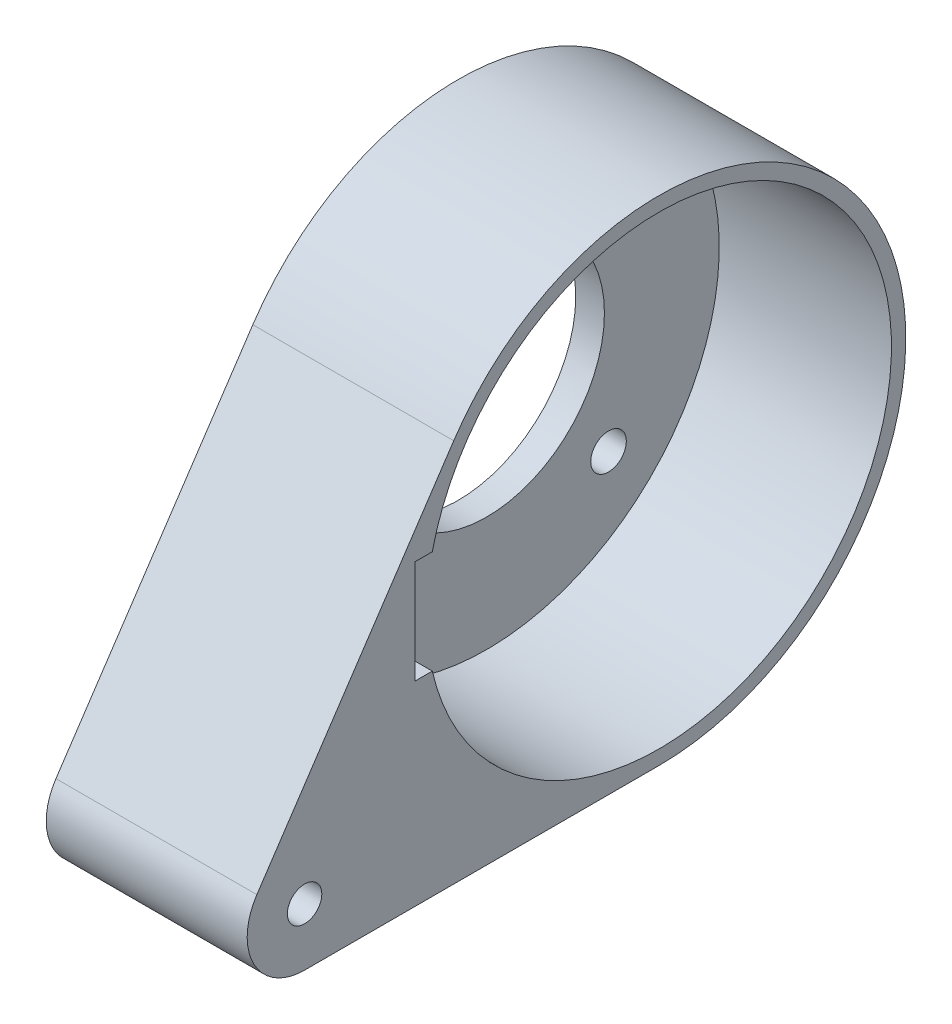
ISO-10303-21;
HEADER;
FILE_DESCRIPTION(('STEP AP214'),'2;1');
FILE_NAME('part.step','',(''),(''),'','','');
FILE_SCHEMA(('AUTOMOTIVE_DESIGN { 1 0 10303 214 1 1 1 1 }'));
ENDSEC;
DATA;
#1=APPLICATION_CONTEXT('core data for automotive mechanical design processes');
#2=APPLICATION_PROTOCOL_DEFINITION('international standard','automotive_design',2000,#1);
#3=PRODUCT_CONTEXT('',#1,'mechanical');
#4=PRODUCT('Part','Part','',(#3));
#5=PRODUCT_RELATED_PRODUCT_CATEGORY('part','',(#4));
#6=PRODUCT_DEFINITION_FORMATION('','',#4);
#7=PRODUCT_DEFINITION_CONTEXT('part definition',#1,'design');
#8=PRODUCT_DEFINITION('design','',#6,#7);
#9=PRODUCT_DEFINITION_SHAPE('','',#8);
#10=(LENGTH_UNIT() NAMED_UNIT(*) SI_UNIT(.MILLI.,.METRE.));
#11=(NAMED_UNIT(*) PLANE_ANGLE_UNIT() SI_UNIT($,.RADIAN.));
#12=(NAMED_UNIT(*) SI_UNIT($,.STERADIAN.) SOLID_ANGLE_UNIT());
#13=UNCERTAINTY_MEASURE_WITH_UNIT(LENGTH_MEASURE(1.E-05),#10,'distance_accuracy_value','');
#14=(GEOMETRIC_REPRESENTATION_CONTEXT(3) GLOBAL_UNCERTAINTY_ASSIGNED_CONTEXT((#13)) GLOBAL_UNIT_ASSIGNED_CONTEXT((#10,
#11,#12)) REPRESENTATION_CONTEXT('',''));
#15=CARTESIAN_POINT('',(0.,0.,0.));
#16=DIRECTION('',(0.,0.,1.));
#17=DIRECTION('',(1.,0.,0.));
#18=AXIS2_PLACEMENT_3D('',#15,#16,#17);
#19=CARTESIAN_POINT('',(2.5,-16.5,30.8666486681013));
#20=DIRECTION('',(1.,0.,0.));
#21=DIRECTION('',(0.,0.,-1.));
#22=AXIS2_PLACEMENT_3D('',#19,#20,#21);
#23=PLANE('',#22);
#24=CARTESIAN_POINT('',(2.5,0.,0.));
#25=DIRECTION('',(1.,0.,0.));
#26=DIRECTION('',(0.,0.,-1.));
#27=AXIS2_PLACEMENT_3D('',#24,#25,#26);
#28=CIRCLE('',#27,10.25);
#29=CARTESIAN_POINT('',(2.5,0.,-10.25));
#30=VERTEX_POINT('',#29);
#31=EDGE_CURVE('E183',#30,#30,#28,.T.);
#32=ORIENTED_EDGE('',*,*,#31,.F.);
#33=EDGE_LOOP('',(#32));
#34=FACE_BOUND('',#33,.T.);
#35=CARTESIAN_POINT('',(2.5,14.488887394336,-3.88228567653784));
#36=DIRECTION('',(1.,0.,0.));
#37=DIRECTION('',(0.,0.,1.));
#38=AXIS2_PLACEMENT_3D('',#35,#36,#37);
#39=CIRCLE('',#38,1.55);
#40=CARTESIAN_POINT('',(2.5,14.488887394336,-2.33228567653784));
#41=VERTEX_POINT('',#40);
#42=EDGE_CURVE('E177',#41,#41,#39,.T.);
#43=ORIENTED_EDGE('',*,*,#42,.F.);
#44=EDGE_LOOP('',(#43));
#45=FACE_BOUND('',#44,.T.);
#46=CARTESIAN_POINT('',(2.5,-10.6066017177982,-10.6066017177982));
#47=DIRECTION('',(1.,0.,0.));
#48=DIRECTION('',(0.,0.,1.));
#49=AXIS2_PLACEMENT_3D('',#46,#47,#48);
#50=CIRCLE('',#49,1.55);
#51=CARTESIAN_POINT('',(2.5,-10.6066017177982,-9.05660171779819));
#52=VERTEX_POINT('',#51);
#53=EDGE_CURVE('E171',#52,#52,#50,.T.);
#54=ORIENTED_EDGE('',*,*,#53,.F.);
#55=EDGE_LOOP('',(#54));
#56=FACE_BOUND('',#55,.T.);
#57=CARTESIAN_POINT('',(2.5,-3.88228567653778,14.488887394336));
#58=DIRECTION('',(1.,0.,0.));
#59=DIRECTION('',(0.,0.,1.));
#60=AXIS2_PLACEMENT_3D('',#57,#58,#59);
#61=CIRCLE('',#60,1.55);
#62=CARTESIAN_POINT('',(2.5,-3.88228567653778,16.038887394336));
#63=VERTEX_POINT('',#62);
#64=EDGE_CURVE('E165',#63,#63,#61,.T.);
#65=ORIENTED_EDGE('',*,*,#64,.F.);
#66=EDGE_LOOP('',(#65));
#67=FACE_BOUND('',#66,.T.);
#68=CARTESIAN_POINT('',(2.5,0.,0.));
#69=DIRECTION('',(-1.,0.,0.));
#70=DIRECTION('',(0.,0.,1.));
#71=AXIS2_PLACEMENT_3D('',#68,#69,#70);
#72=CIRCLE('',#71,20.25);
#73=CARTESIAN_POINT('',(2.5,0.,20.25));
#74=VERTEX_POINT('',#73);
#75=EDGE_CURVE('E146',#74,#74,#72,.T.);
#76=ORIENTED_EDGE('',*,*,#75,.F.);
#77=EDGE_LOOP('',(#76));
#78=FACE_BOUND('',#77,.T.);
#79=ADVANCED_FACE('F40',(#34,#45,#56,#67,#78),#23,.T.);
#80=CARTESIAN_POINT('',(2.5,-16.5,30.8666486681013));
#81=DIRECTION('',(-1.,0.,0.));
#82=DIRECTION('',(0.,0.,1.));
#83=AXIS2_PLACEMENT_3D('',#80,#81,#82);
#84=CYLINDRICAL_SURFACE('',#83,5.);
#85=CARTESIAN_POINT('',(0.,-16.5,30.8666486681013));
#86=DIRECTION('',(1.,0.,0.));
#87=DIRECTION('',(0.,0.,-1.));
#88=AXIS2_PLACEMENT_3D('',#85,#86,#87);
#89=CIRCLE('',#88,5.);
#90=CARTESIAN_POINT('',(0.,-13.7224489795918,35.0241972642129));
#91=VERTEX_POINT('',#90);
#92=CARTESIAN_POINT('',(0.,-21.5,30.8666486681013));
#93=VERTEX_POINT('',#92);
#94=EDGE_CURVE('E189',#91,#93,#89,.T.);
#95=ORIENTED_EDGE('',*,*,#94,.T.);
#96=DIRECTION('',(-1.,0.,0.));
#97=VECTOR('',#96,1.);
#98=CARTESIAN_POINT('',(2.5,-21.5,30.8666486681013));
#99=LINE('',#98,#97);
#100=CARTESIAN_POINT('',(17.5,-21.5,30.8666486681013));
#101=VERTEX_POINT('',#100);
#102=EDGE_CURVE('E48',#101,#93,#99,.T.);
#103=ORIENTED_EDGE('',*,*,#102,.F.);
#104=CARTESIAN_POINT('',(17.5,-16.5,30.8666486681013));
#105=DIRECTION('',(-1.,0.,0.));
#106=DIRECTION('',(0.,0.,1.));
#107=AXIS2_PLACEMENT_3D('',#104,#105,#106);
#108=CIRCLE('',#107,5.);
#109=CARTESIAN_POINT('',(17.5,-13.7224489795918,35.0241972642129));
#110=VERTEX_POINT('',#109);
#111=EDGE_CURVE('E159',#101,#110,#108,.T.);
#112=ORIENTED_EDGE('',*,*,#111,.T.);
#113=DIRECTION('',(-1.,0.,0.));
#114=VECTOR('',#113,1.);
#115=CARTESIAN_POINT('',(2.5,-13.7224489795918,35.0241972642129));
#116=LINE('',#115,#114);
#117=EDGE_CURVE('E197',#110,#91,#116,.T.);
#118=ORIENTED_EDGE('',*,*,#117,.T.);
#119=EDGE_LOOP('',(#95,#103,#112,#118));
#120=FACE_BOUND('',#119,.T.);
#121=ADVANCED_FACE('F42',(#120),#84,.T.);
#122=CARTESIAN_POINT('',(2.5,-21.5,30.8666486681013));
#123=DIRECTION('',(0.,1.,0.));
#124=DIRECTION('',(0.,0.,1.));
#125=AXIS2_PLACEMENT_3D('',#122,#123,#124);
#126=PLANE('',#125);
#127=DIRECTION('',(0.,0.,-1.));
#128=VECTOR('',#127,1.);
#129=CARTESIAN_POINT('',(0.,-21.5,30.8666486681013));
#130=LINE('',#129,#128);
#131=CARTESIAN_POINT('',(0.,-21.5,0.));
#132=VERTEX_POINT('',#131);
#133=EDGE_CURVE('E192',#93,#132,#130,.T.);
#134=ORIENTED_EDGE('',*,*,#133,.T.);
#135=DIRECTION('',(-1.,0.,0.));
#136=VECTOR('',#135,1.);
#137=CARTESIAN_POINT('',(2.5,-21.5,0.));
#138=LINE('',#137,#136);
#139=CARTESIAN_POINT('',(17.5,-21.5,0.));
#140=VERTEX_POINT('',#139);
#141=EDGE_CURVE('E201',#140,#132,#138,.T.);
#142=ORIENTED_EDGE('',*,*,#141,.F.);
#143=DIRECTION('',(0.,0.,1.));
#144=VECTOR('',#143,1.);
#145=CARTESIAN_POINT('',(17.5,-21.5,0.));
#146=LINE('',#145,#144);
#147=EDGE_CURVE('E156',#140,#101,#146,.T.);
#148=ORIENTED_EDGE('',*,*,#147,.T.);
#149=ORIENTED_EDGE('',*,*,#102,.T.);
#150=EDGE_LOOP('',(#134,#142,#148,#149));
#151=FACE_BOUND('',#150,.T.);
#152=ADVANCED_FACE('F205',(#151),#126,.F.);
#153=CARTESIAN_POINT('',(2.5,0.,0.));
#154=DIRECTION('',(-1.,0.,0.));
#155=DIRECTION('',(0.,0.,1.));
#156=AXIS2_PLACEMENT_3D('',#153,#154,#155);
#157=CYLINDRICAL_SURFACE('',#156,21.5);
#158=CARTESIAN_POINT('',(0.,0.,0.));
#159=DIRECTION('',(1.,0.,0.));
#160=DIRECTION('',(0.,0.,-1.));
#161=AXIS2_PLACEMENT_3D('',#158,#159,#160);
#162=CIRCLE('',#161,21.5);
#163=CARTESIAN_POINT('',(0.,11.9434693877551,17.8774589632799));
#164=VERTEX_POINT('',#163);
#165=EDGE_CURVE('E194',#132,#164,#162,.T.);
#166=ORIENTED_EDGE('',*,*,#165,.T.);
#167=DIRECTION('',(-1.,0.,0.));
#168=VECTOR('',#167,1.);
#169=CARTESIAN_POINT('',(2.5,11.9434693877551,17.8774589632799));
#170=LINE('',#169,#168);
#171=CARTESIAN_POINT('',(17.5,11.9434693877551,17.8774589632799));
#172=VERTEX_POINT('',#171);
#173=EDGE_CURVE('E199',#172,#164,#170,.T.);
#174=ORIENTED_EDGE('',*,*,#173,.F.);
#175=CARTESIAN_POINT('',(17.5,0.,0.));
#176=DIRECTION('',(-1.,0.,0.));
#177=DIRECTION('',(0.,0.,1.));
#178=AXIS2_PLACEMENT_3D('',#175,#176,#177);
#179=CIRCLE('',#178,21.5);
#180=EDGE_CURVE('E151',#172,#140,#179,.T.);
#181=ORIENTED_EDGE('',*,*,#180,.T.);
#182=ORIENTED_EDGE('',*,*,#141,.T.);
#183=EDGE_LOOP('',(#166,#174,#181,#182));
#184=FACE_BOUND('',#183,.T.);
#185=ADVANCED_FACE('F214',(#184),#157,.T.);
#186=CARTESIAN_POINT('',(2.5,-13.7224489795918,35.0241972642129));
#187=DIRECTION('',(0.,-0.555510204081633,-0.831509719222321));
#188=DIRECTION('',(0.,0.831509719222321,-0.555510204081633));
#189=AXIS2_PLACEMENT_3D('',#186,#187,#188);
#190=PLANE('',#189);
#191=DIRECTION('',(0.,-0.831509719222321,0.555510204081633));
#192=VECTOR('',#191,1.);
#193=CARTESIAN_POINT('',(0.,-13.7224489795918,35.0241972642129));
#194=LINE('',#193,#192);
#195=EDGE_CURVE('E63',#164,#91,#194,.T.);
#196=ORIENTED_EDGE('',*,*,#195,.T.);
#197=ORIENTED_EDGE('',*,*,#117,.F.);
#198=DIRECTION('',(0.,0.831509719222321,-0.555510204081633));
#199=VECTOR('',#198,1.);
#200=CARTESIAN_POINT('',(17.5,11.9434693877551,17.8774589632799));
#201=LINE('',#200,#199);
#202=EDGE_CURVE('E162',#110,#172,#201,.T.);
#203=ORIENTED_EDGE('',*,*,#202,.T.);
#204=ORIENTED_EDGE('',*,*,#173,.T.);
#205=EDGE_LOOP('',(#196,#197,#203,#204));
#206=FACE_BOUND('',#205,.T.);
#207=ADVANCED_FACE('F216',(#206),#190,.F.);
#208=CARTESIAN_POINT('',(0.,-16.5,30.8666486681013));
#209=DIRECTION('',(1.,0.,0.));
#210=DIRECTION('',(0.,0.,-1.));
#211=AXIS2_PLACEMENT_3D('',#208,#209,#210);
#212=PLANE('',#211);
#213=CARTESIAN_POINT('',(0.,-16.5,30.8666486681013));
#214=DIRECTION('',(1.,0.,0.));
#215=DIRECTION('',(0.,0.,-1.));
#216=AXIS2_PLACEMENT_3D('',#213,#214,#215);
#217=CIRCLE('',#216,1.5);
#218=CARTESIAN_POINT('',(0.,-16.5,29.3666486681013));
#219=VERTEX_POINT('',#218);
#220=EDGE_CURVE('E143',#219,#219,#217,.T.);
#221=ORIENTED_EDGE('',*,*,#220,.T.);
#222=EDGE_LOOP('',(#221));
#223=FACE_BOUND('',#222,.T.);
#224=CARTESIAN_POINT('',(0.,-3.88228567653778,14.488887394336));
#225=DIRECTION('',(1.,0.,0.));
#226=DIRECTION('',(0.,0.,-1.));
#227=AXIS2_PLACEMENT_3D('',#224,#225,#226);
#228=CIRCLE('',#227,1.55);
#229=CARTESIAN_POINT('',(0.,-3.88228567653778,12.938887394336));
#230=VERTEX_POINT('',#229);
#231=EDGE_CURVE('E168',#230,#230,#228,.F.);
#232=ORIENTED_EDGE('',*,*,#231,.F.);
#233=EDGE_LOOP('',(#232));
#234=FACE_BOUND('',#233,.T.);
#235=CARTESIAN_POINT('',(0.,-10.6066017177982,-10.6066017177982));
#236=DIRECTION('',(1.,0.,0.));
#237=DIRECTION('',(0.,0.,-1.));
#238=AXIS2_PLACEMENT_3D('',#235,#236,#237);
#239=CIRCLE('',#238,1.55);
#240=CARTESIAN_POINT('',(0.,-10.6066017177982,-12.1566017177982));
#241=VERTEX_POINT('',#240);
#242=EDGE_CURVE('E174',#241,#241,#239,.F.);
#243=ORIENTED_EDGE('',*,*,#242,.F.);
#244=EDGE_LOOP('',(#243));
#245=FACE_BOUND('',#244,.T.);
#246=CARTESIAN_POINT('',(0.,14.488887394336,-3.88228567653784));
#247=DIRECTION('',(1.,0.,0.));
#248=DIRECTION('',(0.,0.,-1.));
#249=AXIS2_PLACEMENT_3D('',#246,#247,#248);
#250=CIRCLE('',#249,1.55);
#251=CARTESIAN_POINT('',(0.,14.488887394336,-5.43228567653784));
#252=VERTEX_POINT('',#251);
#253=EDGE_CURVE('E180',#252,#252,#250,.F.);
#254=ORIENTED_EDGE('',*,*,#253,.F.);
#255=EDGE_LOOP('',(#254));
#256=FACE_BOUND('',#255,.T.);
#257=CARTESIAN_POINT('',(0.,0.,0.));
#258=DIRECTION('',(1.,0.,0.));
#259=DIRECTION('',(0.,0.,-1.));
#260=AXIS2_PLACEMENT_3D('',#257,#258,#259);
#261=CIRCLE('',#260,10.25);
#262=CARTESIAN_POINT('',(0.,0.,-10.25));
#263=VERTEX_POINT('',#262);
#264=EDGE_CURVE('E186',#263,#263,#261,.F.);
#265=ORIENTED_EDGE('',*,*,#264,.F.);
#266=EDGE_LOOP('',(#265));
#267=FACE_BOUND('',#266,.T.);
#268=ORIENTED_EDGE('',*,*,#94,.F.);
#269=ORIENTED_EDGE('',*,*,#195,.F.);
#270=ORIENTED_EDGE('',*,*,#165,.F.);
#271=ORIENTED_EDGE('',*,*,#133,.F.);
#272=EDGE_LOOP('',(#268,#269,#270,#271));
#273=FACE_BOUND('',#272,.T.);
#274=ADVANCED_FACE('F211',(#223,#234,#245,#256,#267,#273),#212,.F.);
#275=CARTESIAN_POINT('',(-28.9913780286484,0.,0.));
#276=DIRECTION('',(1.,0.,0.));
#277=DIRECTION('',(0.,0.,-1.));
#278=AXIS2_PLACEMENT_3D('',#275,#276,#277);
#279=CYLINDRICAL_SURFACE('',#278,10.25);
#280=ORIENTED_EDGE('',*,*,#264,.T.);
#281=EDGE_LOOP('',(#280));
#282=FACE_BOUND('',#281,.T.);
#283=ORIENTED_EDGE('',*,*,#31,.T.);
#284=EDGE_LOOP('',(#283));
#285=FACE_BOUND('',#284,.T.);
#286=ADVANCED_FACE('F244',(#282,#285),#279,.F.);
#287=CARTESIAN_POINT('',(-28.9913780286484,14.488887394336,-3.88228567653784));
#288=DIRECTION('',(1.,0.,0.));
#289=DIRECTION('',(0.,0.,-1.));
#290=AXIS2_PLACEMENT_3D('',#287,#288,#289);
#291=CYLINDRICAL_SURFACE('',#290,1.55);
#292=ORIENTED_EDGE('',*,*,#253,.T.);
#293=EDGE_LOOP('',(#292));
#294=FACE_BOUND('',#293,.T.);
#295=ORIENTED_EDGE('',*,*,#42,.T.);
#296=EDGE_LOOP('',(#295));
#297=FACE_BOUND('',#296,.T.);
#298=ADVANCED_FACE('F276',(#294,#297),#291,.F.);
#299=CARTESIAN_POINT('',(-28.9913780286484,-10.6066017177982,-10.6066017177982));
#300=DIRECTION('',(1.,0.,0.));
#301=DIRECTION('',(0.,0.,-1.));
#302=AXIS2_PLACEMENT_3D('',#299,#300,#301);
#303=CYLINDRICAL_SURFACE('',#302,1.55);
#304=ORIENTED_EDGE('',*,*,#242,.T.);
#305=EDGE_LOOP('',(#304));
#306=FACE_BOUND('',#305,.T.);
#307=ORIENTED_EDGE('',*,*,#53,.T.);
#308=EDGE_LOOP('',(#307));
#309=FACE_BOUND('',#308,.T.);
#310=ADVANCED_FACE('F230',(#306,#309),#303,.F.);
#311=CARTESIAN_POINT('',(-28.9913780286484,-3.88228567653778,14.488887394336));
#312=DIRECTION('',(1.,0.,0.));
#313=DIRECTION('',(0.,0.,-1.));
#314=AXIS2_PLACEMENT_3D('',#311,#312,#313);
#315=CYLINDRICAL_SURFACE('',#314,1.55);
#316=ORIENTED_EDGE('',*,*,#231,.T.);
#317=EDGE_LOOP('',(#316));
#318=FACE_BOUND('',#317,.T.);
#319=ORIENTED_EDGE('',*,*,#64,.T.);
#320=EDGE_LOOP('',(#319));
#321=FACE_BOUND('',#320,.T.);
#322=ADVANCED_FACE('F220',(#318,#321),#315,.F.);
#323=CARTESIAN_POINT('',(17.5,0.,0.));
#324=DIRECTION('',(-1.,0.,0.));
#325=DIRECTION('',(0.,0.,1.));
#326=AXIS2_PLACEMENT_3D('',#323,#324,#325);
#327=PLANE('',#326);
#328=CARTESIAN_POINT('',(17.5,-16.5,30.8666486681013));
#329=DIRECTION('',(1.,0.,0.));
#330=DIRECTION('',(0.,0.,-1.));
#331=AXIS2_PLACEMENT_3D('',#328,#329,#330);
#332=CIRCLE('',#331,1.5);
#333=CARTESIAN_POINT('',(17.5,-16.5,29.3666486681013));
#334=VERTEX_POINT('',#333);
#335=EDGE_CURVE('E142',#334,#334,#332,.T.);
#336=ORIENTED_EDGE('',*,*,#335,.F.);
#337=EDGE_LOOP('',(#336));
#338=FACE_BOUND('',#337,.T.);
#339=DIRECTION('',(0.,-1.,0.));
#340=VECTOR('',#339,1.);
#341=CARTESIAN_POINT('',(17.5,4.5,21.25));
#342=LINE('',#341,#340);
#343=CARTESIAN_POINT('',(17.5,4.5,21.25));
#344=VERTEX_POINT('',#343);
#345=CARTESIAN_POINT('',(17.5,-4.5,21.25));
#346=VERTEX_POINT('',#345);
#347=EDGE_CURVE('E110',#344,#346,#342,.T.);
#348=ORIENTED_EDGE('',*,*,#347,.F.);
#349=DIRECTION('',(0.,0.,1.));
#350=VECTOR('',#349,1.);
#351=CARTESIAN_POINT('',(17.5,4.5,20.25));
#352=LINE('',#351,#350);
#353=CARTESIAN_POINT('',(17.5,4.5,19.7436698716323));
#354=VERTEX_POINT('',#353);
#355=EDGE_CURVE('E118',#354,#344,#352,.T.);
#356=ORIENTED_EDGE('',*,*,#355,.F.);
#357=CARTESIAN_POINT('',(17.5,0.,0.));
#358=DIRECTION('',(-1.,0.,0.));
#359=DIRECTION('',(0.,0.,1.));
#360=AXIS2_PLACEMENT_3D('',#357,#358,#359);
#361=CIRCLE('',#360,20.25);
#362=CARTESIAN_POINT('',(17.5,-4.5,19.7436698716323));
#363=VERTEX_POINT('',#362);
#364=EDGE_CURVE('E149',#354,#363,#361,.T.);
#365=ORIENTED_EDGE('',*,*,#364,.T.);
#366=DIRECTION('',(0.,0.,-1.));
#367=VECTOR('',#366,1.);
#368=CARTESIAN_POINT('',(17.5,-4.5,20.25));
#369=LINE('',#368,#367);
#370=EDGE_CURVE('E127',#346,#363,#369,.T.);
#371=ORIENTED_EDGE('',*,*,#370,.F.);
#372=EDGE_LOOP('',(#348,#356,#365,#371));
#373=FACE_BOUND('',#372,.T.);
#374=ORIENTED_EDGE('',*,*,#180,.F.);
#375=ORIENTED_EDGE('',*,*,#202,.F.);
#376=ORIENTED_EDGE('',*,*,#111,.F.);
#377=ORIENTED_EDGE('',*,*,#147,.F.);
#378=EDGE_LOOP('',(#374,#375,#376,#377));
#379=FACE_BOUND('',#378,.T.);
#380=ADVANCED_FACE('F129',(#338,#373,#379),#327,.F.);
#381=CARTESIAN_POINT('',(17.5,0.,0.));
#382=DIRECTION('',(-1.,0.,0.));
#383=DIRECTION('',(0.,0.,1.));
#384=AXIS2_PLACEMENT_3D('',#381,#382,#383);
#385=CYLINDRICAL_SURFACE('',#384,20.25);
#386=ORIENTED_EDGE('',*,*,#364,.F.);
#387=DIRECTION('',(1.,0.,0.));
#388=VECTOR('',#387,1.);
#389=CARTESIAN_POINT('',(-6.62518659840052,4.5,19.7436698716323));
#390=LINE('',#389,#388);
#391=CARTESIAN_POINT('',(6.5,4.5,19.7436698716323));
#392=VERTEX_POINT('',#391);
#393=EDGE_CURVE('E123',#392,#354,#390,.T.);
#394=ORIENTED_EDGE('',*,*,#393,.F.);
#395=CARTESIAN_POINT('',(6.5,0.,0.));
#396=DIRECTION('',(1.,0.,0.));
#397=DIRECTION('',(0.,0.,-1.));
#398=AXIS2_PLACEMENT_3D('',#395,#396,#397);
#399=CIRCLE('',#398,20.25);
#400=CARTESIAN_POINT('',(6.5,-4.5,19.7436698716323));
#401=VERTEX_POINT('',#400);
#402=EDGE_CURVE('E13',#401,#392,#399,.F.);
#403=ORIENTED_EDGE('',*,*,#402,.F.);
#404=DIRECTION('',(1.,0.,0.));
#405=VECTOR('',#404,1.);
#406=CARTESIAN_POINT('',(-6.62518659840052,-4.5,19.7436698716323));
#407=LINE('',#406,#405);
#408=EDGE_CURVE('E55',#401,#363,#407,.T.);
#409=ORIENTED_EDGE('',*,*,#408,.T.);
#410=EDGE_LOOP('',(#386,#394,#403,#409));
#411=FACE_BOUND('',#410,.T.);
#412=ORIENTED_EDGE('',*,*,#75,.T.);
#413=EDGE_LOOP('',(#412));
#414=FACE_BOUND('',#413,.T.);
#415=ADVANCED_FACE('F219',(#411,#414),#385,.F.);
#416=CARTESIAN_POINT('',(0.,-16.5,30.8666486681013));
#417=DIRECTION('',(1.,0.,0.));
#418=DIRECTION('',(0.,0.,-1.));
#419=AXIS2_PLACEMENT_3D('',#416,#417,#418);
#420=CYLINDRICAL_SURFACE('',#419,1.5);
#421=ORIENTED_EDGE('',*,*,#220,.F.);
#422=EDGE_LOOP('',(#421));
#423=FACE_BOUND('',#422,.T.);
#424=ORIENTED_EDGE('',*,*,#335,.T.);
#425=EDGE_LOOP('',(#424));
#426=FACE_BOUND('',#425,.T.);
#427=ADVANCED_FACE('F227',(#423,#426),#420,.F.);
#428=CARTESIAN_POINT('',(6.5,-16.5,30.8666486681013));
#429=DIRECTION('',(1.,0.,0.));
#430=DIRECTION('',(0.,0.,-1.));
#431=AXIS2_PLACEMENT_3D('',#428,#429,#430);
#432=PLANE('',#431);
#433=ORIENTED_EDGE('',*,*,#402,.T.);
#434=DIRECTION('',(0.,0.,-1.));
#435=VECTOR('',#434,1.);
#436=CARTESIAN_POINT('',(6.5,4.5,20.25));
#437=LINE('',#436,#435);
#438=CARTESIAN_POINT('',(6.5,4.5,21.25));
#439=VERTEX_POINT('',#438);
#440=EDGE_CURVE('E134',#439,#392,#437,.T.);
#441=ORIENTED_EDGE('',*,*,#440,.F.);
#442=DIRECTION('',(0.,1.,0.));
#443=VECTOR('',#442,1.);
#444=CARTESIAN_POINT('',(6.5,4.5,21.25));
#445=LINE('',#444,#443);
#446=CARTESIAN_POINT('',(6.5,-4.5,21.25));
#447=VERTEX_POINT('',#446);
#448=EDGE_CURVE('E113',#447,#439,#445,.T.);
#449=ORIENTED_EDGE('',*,*,#448,.F.);
#450=DIRECTION('',(0.,0.,1.));
#451=VECTOR('',#450,1.);
#452=CARTESIAN_POINT('',(6.5,-4.5,20.25));
#453=LINE('',#452,#451);
#454=EDGE_CURVE('E138',#401,#447,#453,.T.);
#455=ORIENTED_EDGE('',*,*,#454,.F.);
#456=EDGE_LOOP('',(#433,#441,#449,#455));
#457=FACE_BOUND('',#456,.T.);
#458=ADVANCED_FACE('F339',(#457),#432,.T.);
#459=CARTESIAN_POINT('',(-6.62518659840052,4.5,20.25));
#460=DIRECTION('',(0.,1.,0.));
#461=DIRECTION('',(0.,0.,1.));
#462=AXIS2_PLACEMENT_3D('',#459,#460,#461);
#463=PLANE('',#462);
#464=ORIENTED_EDGE('',*,*,#440,.T.);
#465=ORIENTED_EDGE('',*,*,#393,.T.);
#466=ORIENTED_EDGE('',*,*,#355,.T.);
#467=DIRECTION('',(1.,0.,0.));
#468=VECTOR('',#467,1.);
#469=CARTESIAN_POINT('',(-6.62518659840052,4.5,21.25));
#470=LINE('',#469,#468);
#471=EDGE_CURVE('E105',#439,#344,#470,.T.);
#472=ORIENTED_EDGE('',*,*,#471,.F.);
#473=EDGE_LOOP('',(#464,#465,#466,#472));
#474=FACE_BOUND('',#473,.T.);
#475=ADVANCED_FACE('F121',(#474),#463,.F.);
#476=CARTESIAN_POINT('',(-6.62518659840052,-4.5,20.25));
#477=DIRECTION('',(0.,-1.,0.));
#478=DIRECTION('',(0.,0.,-1.));
#479=AXIS2_PLACEMENT_3D('',#476,#477,#478);
#480=PLANE('',#479);
#481=ORIENTED_EDGE('',*,*,#454,.T.);
#482=DIRECTION('',(1.,0.,0.));
#483=VECTOR('',#482,1.);
#484=CARTESIAN_POINT('',(-6.62518659840052,-4.5,21.25));
#485=LINE('',#484,#483);
#486=EDGE_CURVE('E117',#447,#346,#485,.T.);
#487=ORIENTED_EDGE('',*,*,#486,.T.);
#488=ORIENTED_EDGE('',*,*,#370,.T.);
#489=ORIENTED_EDGE('',*,*,#408,.F.);
#490=EDGE_LOOP('',(#481,#487,#488,#489));
#491=FACE_BOUND('',#490,.T.);
#492=ADVANCED_FACE('F355',(#491),#480,.F.);
#493=CARTESIAN_POINT('',(-6.62518659840052,4.5,21.25));
#494=DIRECTION('',(0.,0.,1.));
#495=DIRECTION('',(1.,0.,0.));
#496=AXIS2_PLACEMENT_3D('',#493,#494,#495);
#497=PLANE('',#496);
#498=ORIENTED_EDGE('',*,*,#448,.T.);
#499=ORIENTED_EDGE('',*,*,#471,.T.);
#500=ORIENTED_EDGE('',*,*,#347,.T.);
#501=ORIENTED_EDGE('',*,*,#486,.F.);
#502=EDGE_LOOP('',(#498,#499,#500,#501));
#503=FACE_BOUND('',#502,.T.);
#504=ADVANCED_FACE('F107',(#503),#497,.F.);
#505=CLOSED_SHELL('',(#79,#121,#152,#185,#207,#274,#286,#298,#310,#322,#380,#415,#427,#458,#475,
#492,#504));
#506=MANIFOLD_SOLID_BREP('B2',#505);
#507=ADVANCED_BREP_SHAPE_REPRESENTATION('',(#18,#506),#14);
#508=SHAPE_DEFINITION_REPRESENTATION(#9,#507);
ENDSEC;
END-ISO-10303-21;
